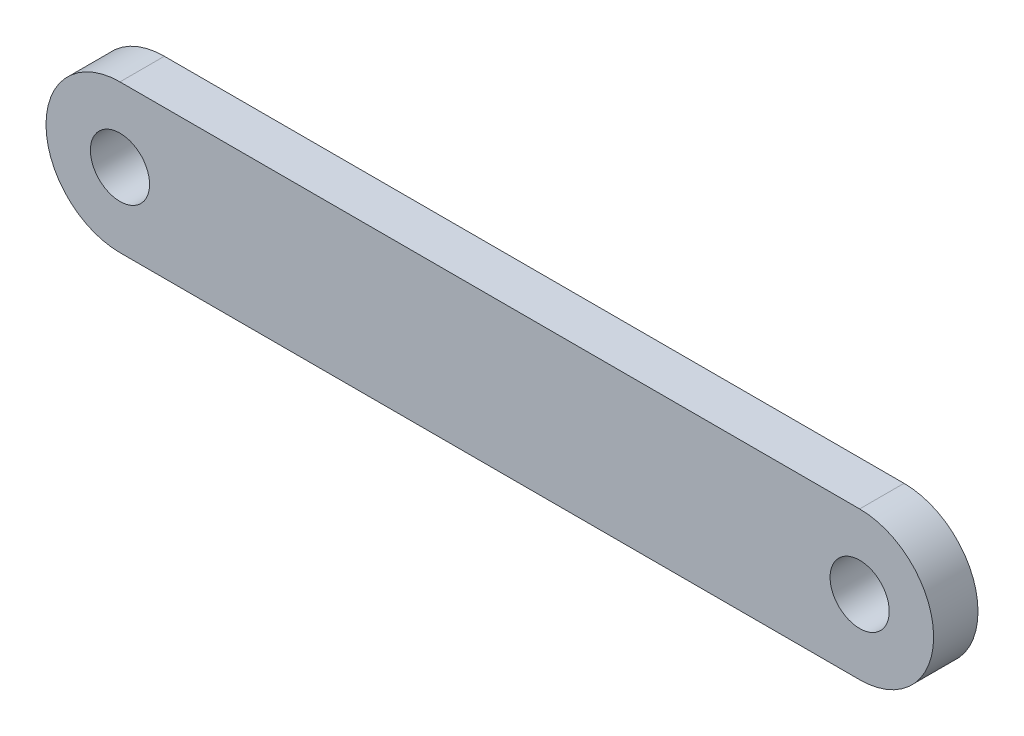
ISO-10303-21;
HEADER;
FILE_DESCRIPTION(('STEP AP214'),'2;1');
FILE_NAME('part.step','',(''),(''),'','','');
FILE_SCHEMA(('AUTOMOTIVE_DESIGN { 1 0 10303 214 1 1 1 1 }'));
ENDSEC;
DATA;
#1=APPLICATION_CONTEXT('core data for automotive mechanical design processes');
#2=APPLICATION_PROTOCOL_DEFINITION('international standard','automotive_design',2000,#1);
#3=PRODUCT_CONTEXT('',#1,'mechanical');
#4=PRODUCT('Part','Part','',(#3));
#5=PRODUCT_RELATED_PRODUCT_CATEGORY('part','',(#4));
#6=PRODUCT_DEFINITION_FORMATION('','',#4);
#7=PRODUCT_DEFINITION_CONTEXT('part definition',#1,'design');
#8=PRODUCT_DEFINITION('design','',#6,#7);
#9=PRODUCT_DEFINITION_SHAPE('','',#8);
#10=(LENGTH_UNIT() NAMED_UNIT(*) SI_UNIT(.MILLI.,.METRE.));
#11=(NAMED_UNIT(*) PLANE_ANGLE_UNIT() SI_UNIT($,.RADIAN.));
#12=(NAMED_UNIT(*) SI_UNIT($,.STERADIAN.) SOLID_ANGLE_UNIT());
#13=UNCERTAINTY_MEASURE_WITH_UNIT(LENGTH_MEASURE(1.E-05),#10,'distance_accuracy_value','');
#14=(GEOMETRIC_REPRESENTATION_CONTEXT(3) GLOBAL_UNCERTAINTY_ASSIGNED_CONTEXT((#13)) GLOBAL_UNIT_ASSIGNED_CONTEXT((#10,
#11,#12)) REPRESENTATION_CONTEXT('',''));
#15=CARTESIAN_POINT('',(0.,0.,0.));
#16=DIRECTION('',(0.,0.,1.));
#17=DIRECTION('',(1.,0.,0.));
#18=AXIS2_PLACEMENT_3D('',#15,#16,#17);
#19=CARTESIAN_POINT('',(44.5462093461292,273.106488261572,3.));
#20=DIRECTION('',(0.,0.,1.));
#21=DIRECTION('',(1.,0.,0.));
#22=AXIS2_PLACEMENT_3D('',#19,#20,#21);
#23=PLANE('',#22);
#24=CARTESIAN_POINT('',(44.5462093461292,273.106488261572,3.));
#25=DIRECTION('',(0.,0.,1.));
#26=DIRECTION('',(1.,0.,0.));
#27=AXIS2_PLACEMENT_3D('',#24,#25,#26);
#28=CIRCLE('',#27,2.);
#29=CARTESIAN_POINT('',(46.5462093461292,273.106488261572,3.));
#30=VERTEX_POINT('',#29);
#31=EDGE_CURVE('E100',#30,#30,#28,.T.);
#32=ORIENTED_EDGE('',*,*,#31,.F.);
#33=EDGE_LOOP('',(#32));
#34=FACE_BOUND('',#33,.T.);
#35=CARTESIAN_POINT('',(44.5462093461292,273.106488261572,3.));
#36=DIRECTION('',(0.,0.,1.));
#37=DIRECTION('',(1.,0.,0.));
#38=AXIS2_PLACEMENT_3D('',#35,#36,#37);
#39=CIRCLE('',#38,5.);
#40=CARTESIAN_POINT('',(44.5462093461292,278.106488261572,3.));
#41=VERTEX_POINT('',#40);
#42=CARTESIAN_POINT('',(44.5462093461292,268.106488261572,3.));
#43=VERTEX_POINT('',#42);
#44=EDGE_CURVE('E85',#41,#43,#39,.T.);
#45=ORIENTED_EDGE('',*,*,#44,.T.);
#46=DIRECTION('',(1.,0.,0.));
#47=VECTOR('',#46,1.);
#48=CARTESIAN_POINT('',(44.5462093461292,268.106488261572,3.));
#49=LINE('',#48,#47);
#50=CARTESIAN_POINT('',(94.5462093461292,268.106488261572,3.));
#51=VERTEX_POINT('',#50);
#52=EDGE_CURVE('E80',#43,#51,#49,.T.);
#53=ORIENTED_EDGE('',*,*,#52,.T.);
#54=CARTESIAN_POINT('',(94.5462093461292,273.106488261572,3.));
#55=DIRECTION('',(0.,0.,1.));
#56=DIRECTION('',(-1.,0.,0.));
#57=AXIS2_PLACEMENT_3D('',#54,#55,#56);
#58=CIRCLE('',#57,5.);
#59=CARTESIAN_POINT('',(94.5462093461292,278.106488261572,3.));
#60=VERTEX_POINT('',#59);
#61=EDGE_CURVE('E83',#51,#60,#58,.T.);
#62=ORIENTED_EDGE('',*,*,#61,.T.);
#63=DIRECTION('',(-1.,0.,0.));
#64=VECTOR('',#63,1.);
#65=CARTESIAN_POINT('',(44.5462093461292,278.106488261572,3.));
#66=LINE('',#65,#64);
#67=EDGE_CURVE('E50',#60,#41,#66,.T.);
#68=ORIENTED_EDGE('',*,*,#67,.T.);
#69=EDGE_LOOP('',(#45,#53,#62,#68));
#70=FACE_BOUND('',#69,.T.);
#71=CARTESIAN_POINT('',(94.5462093461292,273.106488261572,3.));
#72=DIRECTION('',(0.,0.,1.));
#73=DIRECTION('',(1.,0.,0.));
#74=AXIS2_PLACEMENT_3D('',#71,#72,#73);
#75=CIRCLE('',#74,2.);
#76=CARTESIAN_POINT('',(96.5462093461292,273.106488261572,3.));
#77=VERTEX_POINT('',#76);
#78=EDGE_CURVE('E115',#77,#77,#75,.T.);
#79=ORIENTED_EDGE('',*,*,#78,.F.);
#80=EDGE_LOOP('',(#79));
#81=FACE_BOUND('',#80,.T.);
#82=ADVANCED_FACE('F33',(#34,#70,#81),#23,.T.);
#83=CARTESIAN_POINT('',(44.5462093461292,273.106488261572,0.));
#84=DIRECTION('',(0.,0.,1.));
#85=DIRECTION('',(1.,0.,0.));
#86=AXIS2_PLACEMENT_3D('',#83,#84,#85);
#87=PLANE('',#86);
#88=CARTESIAN_POINT('',(44.5462093461292,273.106488261572,0.));
#89=DIRECTION('',(0.,0.,1.));
#90=DIRECTION('',(1.,0.,0.));
#91=AXIS2_PLACEMENT_3D('',#88,#89,#90);
#92=CIRCLE('',#91,5.);
#93=CARTESIAN_POINT('',(44.5462093461292,278.106488261572,0.));
#94=VERTEX_POINT('',#93);
#95=CARTESIAN_POINT('',(44.5462093461292,268.106488261572,0.));
#96=VERTEX_POINT('',#95);
#97=EDGE_CURVE('E97',#94,#96,#92,.T.);
#98=ORIENTED_EDGE('',*,*,#97,.F.);
#99=DIRECTION('',(-1.,0.,0.));
#100=VECTOR('',#99,1.);
#101=CARTESIAN_POINT('',(44.5462093461292,278.106488261572,0.));
#102=LINE('',#101,#100);
#103=CARTESIAN_POINT('',(94.5462093461292,278.106488261572,0.));
#104=VERTEX_POINT('',#103);
#105=EDGE_CURVE('E73',#104,#94,#102,.T.);
#106=ORIENTED_EDGE('',*,*,#105,.F.);
#107=CARTESIAN_POINT('',(94.5462093461292,273.106488261572,0.));
#108=DIRECTION('',(0.,0.,1.));
#109=DIRECTION('',(-1.,0.,0.));
#110=AXIS2_PLACEMENT_3D('',#107,#108,#109);
#111=CIRCLE('',#110,5.);
#112=CARTESIAN_POINT('',(94.5462093461292,268.106488261572,0.));
#113=VERTEX_POINT('',#112);
#114=EDGE_CURVE('E67',#113,#104,#111,.T.);
#115=ORIENTED_EDGE('',*,*,#114,.F.);
#116=DIRECTION('',(1.,0.,0.));
#117=VECTOR('',#116,1.);
#118=CARTESIAN_POINT('',(44.5462093461292,268.106488261572,0.));
#119=LINE('',#118,#117);
#120=EDGE_CURVE('E89',#96,#113,#119,.T.);
#121=ORIENTED_EDGE('',*,*,#120,.F.);
#122=EDGE_LOOP('',(#98,#106,#115,#121));
#123=FACE_BOUND('',#122,.T.);
#124=CARTESIAN_POINT('',(44.5462093461292,273.106488261572,0.));
#125=DIRECTION('',(0.,0.,1.));
#126=DIRECTION('',(1.,0.,0.));
#127=AXIS2_PLACEMENT_3D('',#124,#125,#126);
#128=CIRCLE('',#127,2.);
#129=CARTESIAN_POINT('',(46.5462093461292,273.106488261572,0.));
#130=VERTEX_POINT('',#129);
#131=EDGE_CURVE('E112',#130,#130,#128,.T.);
#132=ORIENTED_EDGE('',*,*,#131,.T.);
#133=EDGE_LOOP('',(#132));
#134=FACE_BOUND('',#133,.T.);
#135=CARTESIAN_POINT('',(94.5462093461292,273.106488261572,0.));
#136=DIRECTION('',(0.,0.,1.));
#137=DIRECTION('',(1.,0.,0.));
#138=AXIS2_PLACEMENT_3D('',#135,#136,#137);
#139=CIRCLE('',#138,2.);
#140=CARTESIAN_POINT('',(96.5462093461292,273.106488261572,0.));
#141=VERTEX_POINT('',#140);
#142=EDGE_CURVE('E118',#141,#141,#139,.T.);
#143=ORIENTED_EDGE('',*,*,#142,.T.);
#144=EDGE_LOOP('',(#143));
#145=FACE_BOUND('',#144,.T.);
#146=ADVANCED_FACE('F108',(#123,#134,#145),#87,.F.);
#147=CARTESIAN_POINT('',(44.5462093461292,273.106488261572,3.));
#148=DIRECTION('',(0.,0.,-1.));
#149=DIRECTION('',(-1.,0.,0.));
#150=AXIS2_PLACEMENT_3D('',#147,#148,#149);
#151=CYLINDRICAL_SURFACE('',#150,5.);
#152=ORIENTED_EDGE('',*,*,#97,.T.);
#153=DIRECTION('',(0.,0.,-1.));
#154=VECTOR('',#153,1.);
#155=CARTESIAN_POINT('',(44.5462093461292,268.106488261572,3.));
#156=LINE('',#155,#154);
#157=EDGE_CURVE('E11',#43,#96,#156,.T.);
#158=ORIENTED_EDGE('',*,*,#157,.F.);
#159=ORIENTED_EDGE('',*,*,#44,.F.);
#160=DIRECTION('',(0.,0.,-1.));
#161=VECTOR('',#160,1.);
#162=CARTESIAN_POINT('',(44.5462093461292,278.106488261572,3.));
#163=LINE('',#162,#161);
#164=EDGE_CURVE('E93',#41,#94,#163,.T.);
#165=ORIENTED_EDGE('',*,*,#164,.T.);
#166=EDGE_LOOP('',(#152,#158,#159,#165));
#167=FACE_BOUND('',#166,.T.);
#168=ADVANCED_FACE('F35',(#167),#151,.T.);
#169=CARTESIAN_POINT('',(44.5462093461292,268.106488261572,3.));
#170=DIRECTION('',(0.,1.,0.));
#171=DIRECTION('',(0.,0.,1.));
#172=AXIS2_PLACEMENT_3D('',#169,#170,#171);
#173=PLANE('',#172);
#174=ORIENTED_EDGE('',*,*,#120,.T.);
#175=DIRECTION('',(0.,0.,-1.));
#176=VECTOR('',#175,1.);
#177=CARTESIAN_POINT('',(94.5462093461292,268.106488261572,3.));
#178=LINE('',#177,#176);
#179=EDGE_CURVE('E42',#51,#113,#178,.T.);
#180=ORIENTED_EDGE('',*,*,#179,.F.);
#181=ORIENTED_EDGE('',*,*,#52,.F.);
#182=ORIENTED_EDGE('',*,*,#157,.T.);
#183=EDGE_LOOP('',(#174,#180,#181,#182));
#184=FACE_BOUND('',#183,.T.);
#185=ADVANCED_FACE('F88',(#184),#173,.F.);
#186=CARTESIAN_POINT('',(94.5462093461292,273.106488261572,3.));
#187=DIRECTION('',(0.,0.,-1.));
#188=DIRECTION('',(-1.,0.,0.));
#189=AXIS2_PLACEMENT_3D('',#186,#187,#188);
#190=CYLINDRICAL_SURFACE('',#189,5.);
#191=ORIENTED_EDGE('',*,*,#114,.T.);
#192=DIRECTION('',(0.,0.,-1.));
#193=VECTOR('',#192,1.);
#194=CARTESIAN_POINT('',(94.5462093461292,278.106488261572,3.));
#195=LINE('',#194,#193);
#196=EDGE_CURVE('E90',#60,#104,#195,.T.);
#197=ORIENTED_EDGE('',*,*,#196,.F.);
#198=ORIENTED_EDGE('',*,*,#61,.F.);
#199=ORIENTED_EDGE('',*,*,#179,.T.);
#200=EDGE_LOOP('',(#191,#197,#198,#199));
#201=FACE_BOUND('',#200,.T.);
#202=ADVANCED_FACE('F91',(#201),#190,.T.);
#203=CARTESIAN_POINT('',(44.5462093461292,278.106488261572,3.));
#204=DIRECTION('',(0.,-1.,0.));
#205=DIRECTION('',(0.,0.,-1.));
#206=AXIS2_PLACEMENT_3D('',#203,#204,#205);
#207=PLANE('',#206);
#208=ORIENTED_EDGE('',*,*,#105,.T.);
#209=ORIENTED_EDGE('',*,*,#164,.F.);
#210=ORIENTED_EDGE('',*,*,#67,.F.);
#211=ORIENTED_EDGE('',*,*,#196,.T.);
#212=EDGE_LOOP('',(#208,#209,#210,#211));
#213=FACE_BOUND('',#212,.T.);
#214=ADVANCED_FACE('F105',(#213),#207,.F.);
#215=CARTESIAN_POINT('',(44.5462093461292,273.106488261572,3.));
#216=DIRECTION('',(0.,0.,-1.));
#217=DIRECTION('',(-1.,0.,0.));
#218=AXIS2_PLACEMENT_3D('',#215,#216,#217);
#219=CYLINDRICAL_SURFACE('',#218,2.);
#220=ORIENTED_EDGE('',*,*,#31,.T.);
#221=EDGE_LOOP('',(#220));
#222=FACE_BOUND('',#221,.T.);
#223=ORIENTED_EDGE('',*,*,#131,.F.);
#224=EDGE_LOOP('',(#223));
#225=FACE_BOUND('',#224,.T.);
#226=ADVANCED_FACE('F135',(#222,#225),#219,.F.);
#227=CARTESIAN_POINT('',(94.5462093461292,273.106488261572,3.));
#228=DIRECTION('',(0.,0.,-1.));
#229=DIRECTION('',(-1.,0.,0.));
#230=AXIS2_PLACEMENT_3D('',#227,#228,#229);
#231=CYLINDRICAL_SURFACE('',#230,2.);
#232=ORIENTED_EDGE('',*,*,#78,.T.);
#233=EDGE_LOOP('',(#232));
#234=FACE_BOUND('',#233,.T.);
#235=ORIENTED_EDGE('',*,*,#142,.F.);
#236=EDGE_LOOP('',(#235));
#237=FACE_BOUND('',#236,.T.);
#238=ADVANCED_FACE('F124',(#234,#237),#231,.F.);
#239=CLOSED_SHELL('',(#82,#146,#168,#185,#202,#214,#226,#238));
#240=MANIFOLD_SOLID_BREP('B2',#239);
#241=ADVANCED_BREP_SHAPE_REPRESENTATION('',(#18,#240),#14);
#242=SHAPE_DEFINITION_REPRESENTATION(#9,#241);
ENDSEC;
END-ISO-10303-21;
